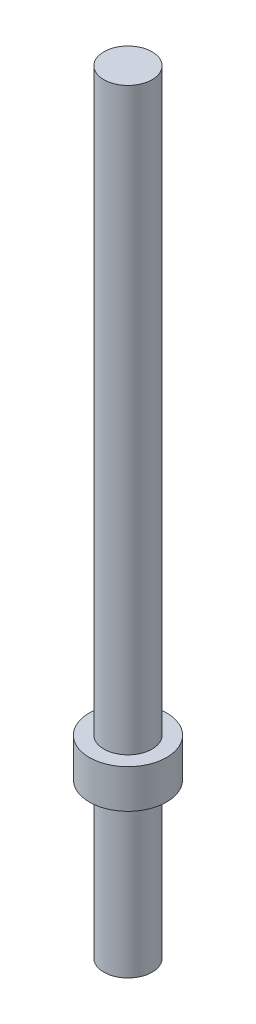
ISO-10303-21;
HEADER;
FILE_DESCRIPTION(('STEP AP214'),'2;1');
FILE_NAME('part.step','',(''),(''),'','','');
FILE_SCHEMA(('AUTOMOTIVE_DESIGN { 1 0 10303 214 1 1 1 1 }'));
ENDSEC;
DATA;
#1=APPLICATION_CONTEXT('core data for automotive mechanical design processes');
#2=APPLICATION_PROTOCOL_DEFINITION('international standard','automotive_design',2000,#1);
#3=PRODUCT_CONTEXT('',#1,'mechanical');
#4=PRODUCT('Part','Part','',(#3));
#5=PRODUCT_RELATED_PRODUCT_CATEGORY('part','',(#4));
#6=PRODUCT_DEFINITION_FORMATION('','',#4);
#7=PRODUCT_DEFINITION_CONTEXT('part definition',#1,'design');
#8=PRODUCT_DEFINITION('design','',#6,#7);
#9=PRODUCT_DEFINITION_SHAPE('','',#8);
#10=(LENGTH_UNIT() NAMED_UNIT(*) SI_UNIT(.MILLI.,.METRE.));
#11=(NAMED_UNIT(*) PLANE_ANGLE_UNIT() SI_UNIT($,.RADIAN.));
#12=(NAMED_UNIT(*) SI_UNIT($,.STERADIAN.) SOLID_ANGLE_UNIT());
#13=UNCERTAINTY_MEASURE_WITH_UNIT(LENGTH_MEASURE(1.E-05),#10,'distance_accuracy_value','');
#14=(GEOMETRIC_REPRESENTATION_CONTEXT(3) GLOBAL_UNCERTAINTY_ASSIGNED_CONTEXT((#13)) GLOBAL_UNIT_ASSIGNED_CONTEXT((#10,
#11,#12)) REPRESENTATION_CONTEXT('',''));
#15=CARTESIAN_POINT('',(0.,0.,0.));
#16=DIRECTION('',(0.,0.,1.));
#17=DIRECTION('',(1.,0.,0.));
#18=AXIS2_PLACEMENT_3D('',#15,#16,#17);
#19=CARTESIAN_POINT('',(0.,60.,0.));
#20=DIRECTION('',(0.,-1.,0.));
#21=DIRECTION('',(0.,0.,-1.));
#22=AXIS2_PLACEMENT_3D('',#19,#20,#21);
#23=CYLINDRICAL_SURFACE('',#22,2.5);
#24=CARTESIAN_POINT('',(0.,60.,0.));
#25=DIRECTION('',(0.,1.,0.));
#26=DIRECTION('',(0.,0.,1.));
#27=AXIS2_PLACEMENT_3D('',#24,#25,#26);
#28=CIRCLE('',#27,2.5);
#29=CARTESIAN_POINT('',(0.,60.,2.5));
#30=VERTEX_POINT('',#29);
#31=EDGE_CURVE('E10',#30,#30,#28,.T.);
#32=ORIENTED_EDGE('',*,*,#31,.F.);
#33=EDGE_LOOP('',(#32));
#34=FACE_BOUND('',#33,.T.);
#35=CARTESIAN_POINT('',(0.,0.,0.));
#36=DIRECTION('',(0.,1.,0.));
#37=DIRECTION('',(0.,0.,1.));
#38=AXIS2_PLACEMENT_3D('',#35,#36,#37);
#39=CIRCLE('',#38,2.5);
#40=CARTESIAN_POINT('',(0.,0.,2.5));
#41=VERTEX_POINT('',#40);
#42=EDGE_CURVE('E36',#41,#41,#39,.T.);
#43=ORIENTED_EDGE('',*,*,#42,.T.);
#44=EDGE_LOOP('',(#43));
#45=FACE_BOUND('',#44,.T.);
#46=ADVANCED_FACE('F30',(#34,#45),#23,.T.);
#47=CARTESIAN_POINT('',(0.,60.,0.));
#48=DIRECTION('',(0.,1.,0.));
#49=DIRECTION('',(0.,0.,1.));
#50=AXIS2_PLACEMENT_3D('',#47,#48,#49);
#51=PLANE('',#50);
#52=ORIENTED_EDGE('',*,*,#31,.T.);
#53=EDGE_LOOP('',(#52));
#54=FACE_BOUND('',#53,.T.);
#55=ADVANCED_FACE('F68',(#54),#51,.T.);
#56=CARTESIAN_POINT('',(0.,-4.,0.));
#57=DIRECTION('',(0.,1.,0.));
#58=DIRECTION('',(0.,0.,1.));
#59=AXIS2_PLACEMENT_3D('',#56,#57,#58);
#60=CYLINDRICAL_SURFACE('',#59,4.);
#61=CARTESIAN_POINT('',(0.,-4.,0.));
#62=DIRECTION('',(0.,1.,0.));
#63=DIRECTION('',(0.,0.,1.));
#64=AXIS2_PLACEMENT_3D('',#61,#62,#63);
#65=CIRCLE('',#64,4.);
#66=CARTESIAN_POINT('',(0.,-4.,4.));
#67=VERTEX_POINT('',#66);
#68=EDGE_CURVE('E40',#67,#67,#65,.T.);
#69=ORIENTED_EDGE('',*,*,#68,.T.);
#70=EDGE_LOOP('',(#69));
#71=FACE_BOUND('',#70,.T.);
#72=CARTESIAN_POINT('',(0.,0.,0.));
#73=DIRECTION('',(0.,1.,0.));
#74=DIRECTION('',(0.,0.,1.));
#75=AXIS2_PLACEMENT_3D('',#72,#73,#74);
#76=CIRCLE('',#75,4.);
#77=CARTESIAN_POINT('',(0.,0.,4.));
#78=VERTEX_POINT('',#77);
#79=EDGE_CURVE('E44',#78,#78,#76,.T.);
#80=ORIENTED_EDGE('',*,*,#79,.F.);
#81=EDGE_LOOP('',(#80));
#82=FACE_BOUND('',#81,.T.);
#83=ADVANCED_FACE('F73',(#71,#82),#60,.T.);
#84=CARTESIAN_POINT('',(0.,-4.,0.));
#85=DIRECTION('',(0.,1.,0.));
#86=DIRECTION('',(0.,0.,1.));
#87=AXIS2_PLACEMENT_3D('',#84,#85,#86);
#88=PLANE('',#87);
#89=CARTESIAN_POINT('',(0.,-4.,0.));
#90=DIRECTION('',(0.,1.,0.));
#91=DIRECTION('',(0.,0.,1.));
#92=AXIS2_PLACEMENT_3D('',#89,#90,#91);
#93=CIRCLE('',#92,2.5);
#94=CARTESIAN_POINT('',(0.,-4.,2.5));
#95=VERTEX_POINT('',#94);
#96=EDGE_CURVE('E48',#95,#95,#93,.T.);
#97=ORIENTED_EDGE('',*,*,#96,.T.);
#98=EDGE_LOOP('',(#97));
#99=FACE_BOUND('',#98,.T.);
#100=ORIENTED_EDGE('',*,*,#68,.F.);
#101=EDGE_LOOP('',(#100));
#102=FACE_BOUND('',#101,.T.);
#103=ADVANCED_FACE('F77',(#99,#102),#88,.F.);
#104=CARTESIAN_POINT('',(0.,0.,0.));
#105=DIRECTION('',(0.,1.,0.));
#106=DIRECTION('',(0.,0.,1.));
#107=AXIS2_PLACEMENT_3D('',#104,#105,#106);
#108=PLANE('',#107);
#109=ORIENTED_EDGE('',*,*,#42,.F.);
#110=EDGE_LOOP('',(#109));
#111=FACE_BOUND('',#110,.T.);
#112=ORIENTED_EDGE('',*,*,#79,.T.);
#113=EDGE_LOOP('',(#112));
#114=FACE_BOUND('',#113,.T.);
#115=ADVANCED_FACE('F65',(#111,#114),#108,.T.);
#116=CARTESIAN_POINT('',(0.,-20.,0.));
#117=DIRECTION('',(0.,1.,0.));
#118=DIRECTION('',(0.,0.,1.));
#119=AXIS2_PLACEMENT_3D('',#116,#117,#118);
#120=CYLINDRICAL_SURFACE('',#119,2.5);
#121=CARTESIAN_POINT('',(0.,-20.,0.));
#122=DIRECTION('',(0.,1.,0.));
#123=DIRECTION('',(0.,0.,1.));
#124=AXIS2_PLACEMENT_3D('',#121,#122,#123);
#125=CIRCLE('',#124,2.5);
#126=CARTESIAN_POINT('',(0.,-20.,2.5));
#127=VERTEX_POINT('',#126);
#128=EDGE_CURVE('E52',#127,#127,#125,.T.);
#129=ORIENTED_EDGE('',*,*,#128,.T.);
#130=EDGE_LOOP('',(#129));
#131=FACE_BOUND('',#130,.T.);
#132=ORIENTED_EDGE('',*,*,#96,.F.);
#133=EDGE_LOOP('',(#132));
#134=FACE_BOUND('',#133,.T.);
#135=ADVANCED_FACE('F56',(#131,#134),#120,.T.);
#136=CARTESIAN_POINT('',(0.,-20.,0.));
#137=DIRECTION('',(0.,1.,0.));
#138=DIRECTION('',(0.,0.,1.));
#139=AXIS2_PLACEMENT_3D('',#136,#137,#138);
#140=PLANE('',#139);
#141=ORIENTED_EDGE('',*,*,#128,.F.);
#142=EDGE_LOOP('',(#141));
#143=FACE_BOUND('',#142,.T.);
#144=ADVANCED_FACE('F59',(#143),#140,.F.);
#145=CLOSED_SHELL('',(#46,#55,#83,#103,#115,#135,#144));
#146=MANIFOLD_SOLID_BREP('B2',#145);
#147=ADVANCED_BREP_SHAPE_REPRESENTATION('',(#18,#146),#14);
#148=SHAPE_DEFINITION_REPRESENTATION(#9,#147);
ENDSEC;
END-ISO-10303-21;
